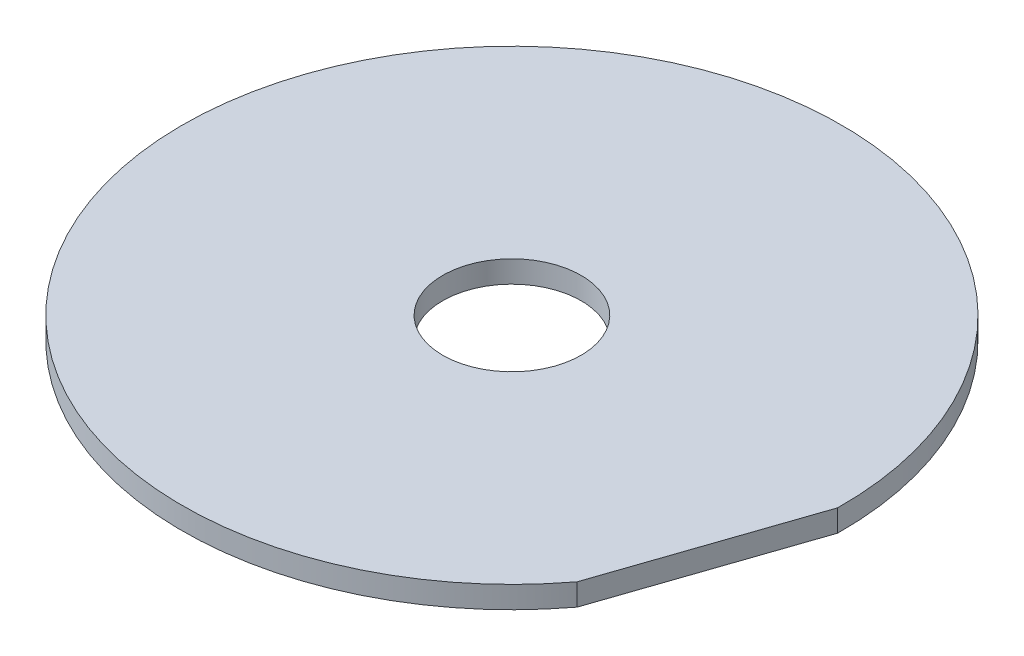
ISO-10303-21;
HEADER;
FILE_DESCRIPTION(('STEP AP214'),'2;1');
FILE_NAME('part.step','',(''),(''),'','','');
FILE_SCHEMA(('AUTOMOTIVE_DESIGN { 1 0 10303 214 1 1 1 1 }'));
ENDSEC;
DATA;
#1=APPLICATION_CONTEXT('core data for automotive mechanical design processes');
#2=APPLICATION_PROTOCOL_DEFINITION('international standard','automotive_design',2000,#1);
#3=PRODUCT_CONTEXT('',#1,'mechanical');
#4=PRODUCT('Part','Part','',(#3));
#5=PRODUCT_RELATED_PRODUCT_CATEGORY('part','',(#4));
#6=PRODUCT_DEFINITION_FORMATION('','',#4);
#7=PRODUCT_DEFINITION_CONTEXT('part definition',#1,'design');
#8=PRODUCT_DEFINITION('design','',#6,#7);
#9=PRODUCT_DEFINITION_SHAPE('','',#8);
#10=(LENGTH_UNIT() NAMED_UNIT(*) SI_UNIT(.MILLI.,.METRE.));
#11=(NAMED_UNIT(*) PLANE_ANGLE_UNIT() SI_UNIT($,.RADIAN.));
#12=(NAMED_UNIT(*) SI_UNIT($,.STERADIAN.) SOLID_ANGLE_UNIT());
#13=UNCERTAINTY_MEASURE_WITH_UNIT(LENGTH_MEASURE(1.E-05),#10,'distance_accuracy_value','');
#14=(GEOMETRIC_REPRESENTATION_CONTEXT(3) GLOBAL_UNCERTAINTY_ASSIGNED_CONTEXT((#13)) GLOBAL_UNIT_ASSIGNED_CONTEXT((#10,
#11,#12)) REPRESENTATION_CONTEXT('',''));
#15=CARTESIAN_POINT('',(0.,0.,0.));
#16=DIRECTION('',(0.,0.,1.));
#17=DIRECTION('',(1.,0.,0.));
#18=AXIS2_PLACEMENT_3D('',#15,#16,#17);
#19=CARTESIAN_POINT('',(0.,1.,0.));
#20=DIRECTION('',(0.,1.,0.));
#21=DIRECTION('',(0.,0.,1.));
#22=AXIS2_PLACEMENT_3D('',#19,#20,#21);
#23=PLANE('',#22);
#24=DIRECTION('',(-0.322361630497461,0.,0.94661659566216));
#25=VECTOR('',#24,1.);
#26=CARTESIAN_POINT('',(11.9886076189623,1.,9.01516984635118));
#27=LINE('',#26,#25);
#28=CARTESIAN_POINT('',(14.9989767344344,1.,0.175205364917133));
#29=VERTEX_POINT('',#28);
#30=CARTESIAN_POINT('',(11.9886076189623,1.,9.01516984635118));
#31=VERTEX_POINT('',#30);
#32=EDGE_CURVE('E62',#29,#31,#27,.T.);
#33=ORIENTED_EDGE('',*,*,#32,.F.);
#34=CARTESIAN_POINT('',(0.,1.,0.));
#35=DIRECTION('',(0.,1.,0.));
#36=DIRECTION('',(0.,0.,1.));
#37=AXIS2_PLACEMENT_3D('',#34,#35,#36);
#38=CIRCLE('',#37,15.);
#39=EDGE_CURVE('E11',#29,#31,#38,.T.);
#40=ORIENTED_EDGE('',*,*,#39,.T.);
#41=EDGE_LOOP('',(#33,#40));
#42=FACE_BOUND('',#41,.T.);
#43=CARTESIAN_POINT('',(0.,1.,0.));
#44=DIRECTION('',(0.,1.,0.));
#45=DIRECTION('',(0.,0.,1.));
#46=AXIS2_PLACEMENT_3D('',#43,#44,#45);
#47=CIRCLE('',#46,3.15);
#48=CARTESIAN_POINT('',(0.,1.,3.15));
#49=VERTEX_POINT('',#48);
#50=EDGE_CURVE('E74',#49,#49,#47,.T.);
#51=ORIENTED_EDGE('',*,*,#50,.F.);
#52=EDGE_LOOP('',(#51));
#53=FACE_BOUND('',#52,.T.);
#54=ADVANCED_FACE('F35',(#42,#53),#23,.T.);
#55=CARTESIAN_POINT('',(0.,0.,0.));
#56=DIRECTION('',(0.,1.,0.));
#57=DIRECTION('',(0.,0.,1.));
#58=AXIS2_PLACEMENT_3D('',#55,#56,#57);
#59=PLANE('',#58);
#60=CARTESIAN_POINT('',(0.,0.,0.));
#61=DIRECTION('',(0.,1.,0.));
#62=DIRECTION('',(0.,0.,1.));
#63=AXIS2_PLACEMENT_3D('',#60,#61,#62);
#64=CIRCLE('',#63,15.);
#65=CARTESIAN_POINT('',(14.9989767344344,0.,0.175205364917133));
#66=VERTEX_POINT('',#65);
#67=CARTESIAN_POINT('',(11.9886076189623,0.,9.01516984635118));
#68=VERTEX_POINT('',#67);
#69=EDGE_CURVE('E39',#66,#68,#64,.T.);
#70=ORIENTED_EDGE('',*,*,#69,.F.);
#71=DIRECTION('',(-0.322361630497461,0.,0.94661659566216));
#72=VECTOR('',#71,1.);
#73=CARTESIAN_POINT('',(11.9886076189623,0.,9.01516984635118));
#74=LINE('',#73,#72);
#75=EDGE_CURVE('E50',#66,#68,#74,.T.);
#76=ORIENTED_EDGE('',*,*,#75,.T.);
#77=EDGE_LOOP('',(#70,#76));
#78=FACE_BOUND('',#77,.T.);
#79=CARTESIAN_POINT('',(0.,0.,0.));
#80=DIRECTION('',(0.,1.,0.));
#81=DIRECTION('',(0.,0.,1.));
#82=AXIS2_PLACEMENT_3D('',#79,#80,#81);
#83=CIRCLE('',#82,3.15);
#84=CARTESIAN_POINT('',(0.,0.,3.15));
#85=VERTEX_POINT('',#84);
#86=EDGE_CURVE('E71',#85,#85,#83,.T.);
#87=ORIENTED_EDGE('',*,*,#86,.T.);
#88=EDGE_LOOP('',(#87));
#89=FACE_BOUND('',#88,.T.);
#90=ADVANCED_FACE('F84',(#78,#89),#59,.F.);
#91=CARTESIAN_POINT('',(0.,1.,0.));
#92=DIRECTION('',(0.,-1.,0.));
#93=DIRECTION('',(0.,0.,-1.));
#94=AXIS2_PLACEMENT_3D('',#91,#92,#93);
#95=CYLINDRICAL_SURFACE('',#94,15.);
#96=ORIENTED_EDGE('',*,*,#69,.T.);
#97=DIRECTION('',(0.,1.,0.));
#98=VECTOR('',#97,1.);
#99=CARTESIAN_POINT('',(11.9886076189623,0.,9.01516984635118));
#100=LINE('',#99,#98);
#101=EDGE_CURVE('E56',#68,#31,#100,.T.);
#102=ORIENTED_EDGE('',*,*,#101,.T.);
#103=ORIENTED_EDGE('',*,*,#39,.F.);
#104=DIRECTION('',(0.,1.,0.));
#105=VECTOR('',#104,1.);
#106=CARTESIAN_POINT('',(14.9989767344344,0.,0.175205364917133));
#107=LINE('',#106,#105);
#108=EDGE_CURVE('E59',#66,#29,#107,.T.);
#109=ORIENTED_EDGE('',*,*,#108,.F.);
#110=EDGE_LOOP('',(#96,#102,#103,#109));
#111=FACE_BOUND('',#110,.T.);
#112=ADVANCED_FACE('F37',(#111),#95,.T.);
#113=CARTESIAN_POINT('',(0.,1.,0.));
#114=DIRECTION('',(0.,-1.,0.));
#115=DIRECTION('',(0.,0.,-1.));
#116=AXIS2_PLACEMENT_3D('',#113,#114,#115);
#117=CYLINDRICAL_SURFACE('',#116,3.15);
#118=ORIENTED_EDGE('',*,*,#50,.T.);
#119=EDGE_LOOP('',(#118));
#120=FACE_BOUND('',#119,.T.);
#121=ORIENTED_EDGE('',*,*,#86,.F.);
#122=EDGE_LOOP('',(#121));
#123=FACE_BOUND('',#122,.T.);
#124=ADVANCED_FACE('F81',(#120,#123),#117,.F.);
#125=CARTESIAN_POINT('',(11.9886076189623,0.,9.01516984635118));
#126=DIRECTION('',(-0.946616595662161,0.,-0.322361630497461));
#127=DIRECTION('',(-0.322361630497461,0.,0.946616595662161));
#128=AXIS2_PLACEMENT_3D('',#125,#126,#127);
#129=PLANE('',#128);
#130=ORIENTED_EDGE('',*,*,#32,.T.);
#131=ORIENTED_EDGE('',*,*,#101,.F.);
#132=ORIENTED_EDGE('',*,*,#75,.F.);
#133=ORIENTED_EDGE('',*,*,#108,.T.);
#134=EDGE_LOOP('',(#130,#131,#132,#133));
#135=FACE_BOUND('',#134,.T.);
#136=ADVANCED_FACE('F61',(#135),#129,.F.);
#137=CLOSED_SHELL('',(#54,#90,#112,#124,#136));
#138=MANIFOLD_SOLID_BREP('B2',#137);
#139=ADVANCED_BREP_SHAPE_REPRESENTATION('',(#18,#138),#14);
#140=SHAPE_DEFINITION_REPRESENTATION(#9,#139);
ENDSEC;
END-ISO-10303-21;
